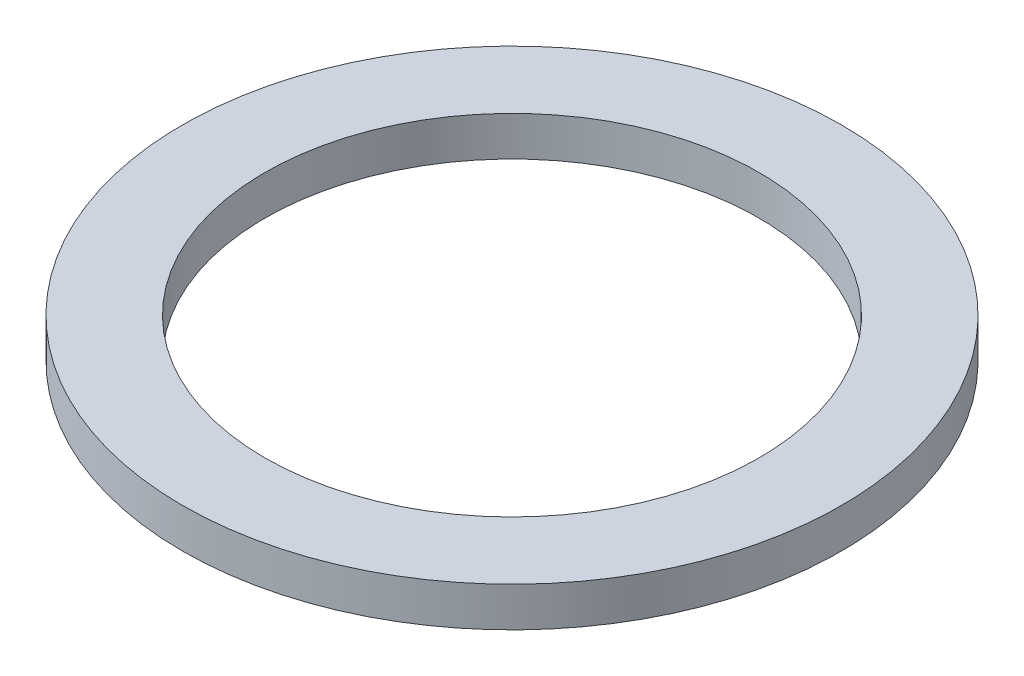
ISO-10303-21;
HEADER;
FILE_DESCRIPTION(('STEP AP214'),'2;1');
FILE_NAME('part.step','',(''),(''),'','','');
FILE_SCHEMA(('AUTOMOTIVE_DESIGN { 1 0 10303 214 1 1 1 1 }'));
ENDSEC;
DATA;
#1=APPLICATION_CONTEXT('core data for automotive mechanical design processes');
#2=APPLICATION_PROTOCOL_DEFINITION('international standard','automotive_design',2000,#1);
#3=PRODUCT_CONTEXT('',#1,'mechanical');
#4=PRODUCT('Part','Part','',(#3));
#5=PRODUCT_RELATED_PRODUCT_CATEGORY('part','',(#4));
#6=PRODUCT_DEFINITION_FORMATION('','',#4);
#7=PRODUCT_DEFINITION_CONTEXT('part definition',#1,'design');
#8=PRODUCT_DEFINITION('design','',#6,#7);
#9=PRODUCT_DEFINITION_SHAPE('','',#8);
#10=(LENGTH_UNIT() NAMED_UNIT(*) SI_UNIT(.MILLI.,.METRE.));
#11=(NAMED_UNIT(*) PLANE_ANGLE_UNIT() SI_UNIT($,.RADIAN.));
#12=(NAMED_UNIT(*) SI_UNIT($,.STERADIAN.) SOLID_ANGLE_UNIT());
#13=UNCERTAINTY_MEASURE_WITH_UNIT(LENGTH_MEASURE(1.E-05),#10,'distance_accuracy_value','');
#14=(GEOMETRIC_REPRESENTATION_CONTEXT(3) GLOBAL_UNCERTAINTY_ASSIGNED_CONTEXT((#13)) GLOBAL_UNIT_ASSIGNED_CONTEXT((#10,
#11,#12)) REPRESENTATION_CONTEXT('',''));
#15=CARTESIAN_POINT('',(0.,0.,0.));
#16=DIRECTION('',(0.,0.,1.));
#17=DIRECTION('',(1.,0.,0.));
#18=AXIS2_PLACEMENT_3D('',#15,#16,#17);
#19=CARTESIAN_POINT('',(0.,1.2,0.));
#20=DIRECTION('',(0.,1.,0.));
#21=DIRECTION('',(0.,0.,1.));
#22=AXIS2_PLACEMENT_3D('',#19,#20,#21);
#23=PLANE('',#22);
#24=CARTESIAN_POINT('',(0.,1.2,0.));
#25=DIRECTION('',(0.,1.,0.));
#26=DIRECTION('',(0.,0.,1.));
#27=AXIS2_PLACEMENT_3D('',#24,#25,#26);
#28=CIRCLE('',#27,10.);
#29=CARTESIAN_POINT('',(0.,1.2,10.));
#30=VERTEX_POINT('',#29);
#31=EDGE_CURVE('E10',#30,#30,#28,.T.);
#32=ORIENTED_EDGE('',*,*,#31,.T.);
#33=EDGE_LOOP('',(#32));
#34=FACE_BOUND('',#33,.T.);
#35=CARTESIAN_POINT('',(0.,1.2,0.));
#36=DIRECTION('',(0.,1.,0.));
#37=DIRECTION('',(0.,0.,1.));
#38=AXIS2_PLACEMENT_3D('',#35,#36,#37);
#39=CIRCLE('',#38,7.5);
#40=CARTESIAN_POINT('',(0.,1.2,7.5));
#41=VERTEX_POINT('',#40);
#42=EDGE_CURVE('E47',#41,#41,#39,.T.);
#43=ORIENTED_EDGE('',*,*,#42,.F.);
#44=EDGE_LOOP('',(#43));
#45=FACE_BOUND('',#44,.T.);
#46=ADVANCED_FACE('F36',(#34,#45),#23,.T.);
#47=CARTESIAN_POINT('',(0.,0.,0.));
#48=DIRECTION('',(0.,1.,0.));
#49=DIRECTION('',(0.,0.,1.));
#50=AXIS2_PLACEMENT_3D('',#47,#48,#49);
#51=PLANE('',#50);
#52=CARTESIAN_POINT('',(0.,0.,0.));
#53=DIRECTION('',(0.,1.,0.));
#54=DIRECTION('',(0.,0.,1.));
#55=AXIS2_PLACEMENT_3D('',#52,#53,#54);
#56=CIRCLE('',#55,10.);
#57=CARTESIAN_POINT('',(0.,0.,10.));
#58=VERTEX_POINT('',#57);
#59=EDGE_CURVE('E40',#58,#58,#56,.T.);
#60=ORIENTED_EDGE('',*,*,#59,.F.);
#61=EDGE_LOOP('',(#60));
#62=FACE_BOUND('',#61,.T.);
#63=CARTESIAN_POINT('',(0.,0.,0.));
#64=DIRECTION('',(0.,1.,0.));
#65=DIRECTION('',(0.,0.,1.));
#66=AXIS2_PLACEMENT_3D('',#63,#64,#65);
#67=CIRCLE('',#66,7.5);
#68=CARTESIAN_POINT('',(0.,0.,7.5));
#69=VERTEX_POINT('',#68);
#70=EDGE_CURVE('E49',#69,#69,#67,.T.);
#71=ORIENTED_EDGE('',*,*,#70,.T.);
#72=EDGE_LOOP('',(#71));
#73=FACE_BOUND('',#72,.T.);
#74=ADVANCED_FACE('F59',(#62,#73),#51,.F.);
#75=CARTESIAN_POINT('',(0.,1.2,0.));
#76=DIRECTION('',(0.,-1.,0.));
#77=DIRECTION('',(0.,0.,-1.));
#78=AXIS2_PLACEMENT_3D('',#75,#76,#77);
#79=CYLINDRICAL_SURFACE('',#78,10.);
#80=ORIENTED_EDGE('',*,*,#31,.F.);
#81=EDGE_LOOP('',(#80));
#82=FACE_BOUND('',#81,.T.);
#83=ORIENTED_EDGE('',*,*,#59,.T.);
#84=EDGE_LOOP('',(#83));
#85=FACE_BOUND('',#84,.T.);
#86=ADVANCED_FACE('F38',(#82,#85),#79,.T.);
#87=CARTESIAN_POINT('',(0.,1.2,0.));
#88=DIRECTION('',(0.,-1.,0.));
#89=DIRECTION('',(0.,0.,-1.));
#90=AXIS2_PLACEMENT_3D('',#87,#88,#89);
#91=CYLINDRICAL_SURFACE('',#90,7.5);
#92=ORIENTED_EDGE('',*,*,#42,.T.);
#93=EDGE_LOOP('',(#92));
#94=FACE_BOUND('',#93,.T.);
#95=ORIENTED_EDGE('',*,*,#70,.F.);
#96=EDGE_LOOP('',(#95));
#97=FACE_BOUND('',#96,.T.);
#98=ADVANCED_FACE('F55',(#94,#97),#91,.F.);
#99=CLOSED_SHELL('',(#46,#74,#86,#98));
#100=MANIFOLD_SOLID_BREP('B2',#99);
#101=ADVANCED_BREP_SHAPE_REPRESENTATION('',(#18,#100),#14);
#102=SHAPE_DEFINITION_REPRESENTATION(#9,#101);
ENDSEC;
END-ISO-10303-21;
